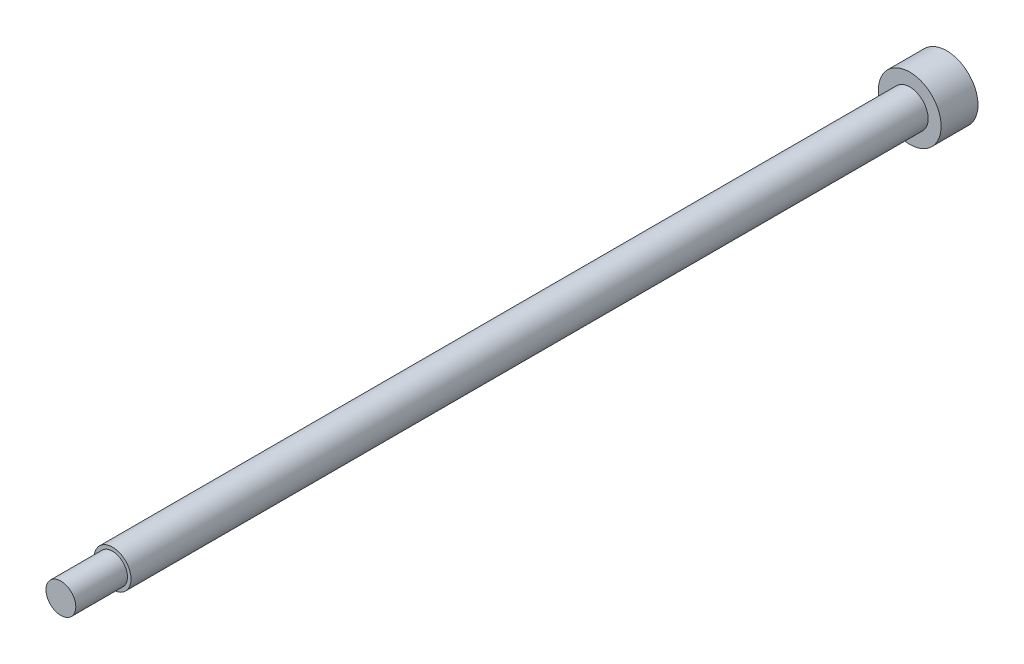
ISO-10303-21;
HEADER;
FILE_DESCRIPTION(('STEP AP214'),'2;1');
FILE_NAME('part.step','',(''),(''),'','','');
FILE_SCHEMA(('AUTOMOTIVE_DESIGN { 1 0 10303 214 1 1 1 1 }'));
ENDSEC;
DATA;
#1=APPLICATION_CONTEXT('core data for automotive mechanical design processes');
#2=APPLICATION_PROTOCOL_DEFINITION('international standard','automotive_design',2000,#1);
#3=PRODUCT_CONTEXT('',#1,'mechanical');
#4=PRODUCT('Part','Part','',(#3));
#5=PRODUCT_RELATED_PRODUCT_CATEGORY('part','',(#4));
#6=PRODUCT_DEFINITION_FORMATION('','',#4);
#7=PRODUCT_DEFINITION_CONTEXT('part definition',#1,'design');
#8=PRODUCT_DEFINITION('design','',#6,#7);
#9=PRODUCT_DEFINITION_SHAPE('','',#8);
#10=(LENGTH_UNIT() NAMED_UNIT(*) SI_UNIT(.MILLI.,.METRE.));
#11=(NAMED_UNIT(*) PLANE_ANGLE_UNIT() SI_UNIT($,.RADIAN.));
#12=(NAMED_UNIT(*) SI_UNIT($,.STERADIAN.) SOLID_ANGLE_UNIT());
#13=UNCERTAINTY_MEASURE_WITH_UNIT(LENGTH_MEASURE(1.E-05),#10,'distance_accuracy_value','');
#14=(GEOMETRIC_REPRESENTATION_CONTEXT(3) GLOBAL_UNCERTAINTY_ASSIGNED_CONTEXT((#13)) GLOBAL_UNIT_ASSIGNED_CONTEXT((#10,
#11,#12)) REPRESENTATION_CONTEXT('',''));
#15=CARTESIAN_POINT('',(0.,0.,0.));
#16=DIRECTION('',(0.,0.,1.));
#17=DIRECTION('',(1.,0.,0.));
#18=AXIS2_PLACEMENT_3D('',#15,#16,#17);
#19=CARTESIAN_POINT('',(0.,0.,115.));
#20=DIRECTION('',(0.,0.,-1.));
#21=DIRECTION('',(-1.,0.,0.));
#22=AXIS2_PLACEMENT_3D('',#19,#20,#21);
#23=CYLINDRICAL_SURFACE('',#22,2.5);
#24=CARTESIAN_POINT('',(0.,0.,115.));
#25=DIRECTION('',(0.,0.,1.));
#26=DIRECTION('',(1.,0.,0.));
#27=AXIS2_PLACEMENT_3D('',#24,#25,#26);
#28=CIRCLE('',#27,2.5);
#29=CARTESIAN_POINT('',(2.5,0.,115.));
#30=VERTEX_POINT('',#29);
#31=EDGE_CURVE('E42',#30,#30,#28,.T.);
#32=ORIENTED_EDGE('',*,*,#31,.F.);
#33=EDGE_LOOP('',(#32));
#34=FACE_BOUND('',#33,.T.);
#35=CARTESIAN_POINT('',(0.,0.,7.));
#36=DIRECTION('',(0.,0.,1.));
#37=DIRECTION('',(1.,0.,0.));
#38=AXIS2_PLACEMENT_3D('',#35,#36,#37);
#39=CIRCLE('',#38,2.5);
#40=CARTESIAN_POINT('',(2.5,0.,7.));
#41=VERTEX_POINT('',#40);
#42=EDGE_CURVE('E37',#41,#41,#39,.T.);
#43=ORIENTED_EDGE('',*,*,#42,.T.);
#44=EDGE_LOOP('',(#43));
#45=FACE_BOUND('',#44,.T.);
#46=ADVANCED_FACE('F40',(#34,#45),#23,.T.);
#47=CARTESIAN_POINT('',(0.,0.,115.));
#48=DIRECTION('',(0.,0.,1.));
#49=DIRECTION('',(1.,0.,0.));
#50=AXIS2_PLACEMENT_3D('',#47,#48,#49);
#51=PLANE('',#50);
#52=CARTESIAN_POINT('',(0.,0.,115.));
#53=DIRECTION('',(0.,0.,1.));
#54=DIRECTION('',(1.,0.,0.));
#55=AXIS2_PLACEMENT_3D('',#52,#53,#54);
#56=CIRCLE('',#55,2.02);
#57=CARTESIAN_POINT('',(2.02,0.,115.));
#58=VERTEX_POINT('',#57);
#59=EDGE_CURVE('E10',#58,#58,#56,.T.);
#60=ORIENTED_EDGE('',*,*,#59,.F.);
#61=EDGE_LOOP('',(#60));
#62=FACE_BOUND('',#61,.T.);
#63=ORIENTED_EDGE('',*,*,#31,.T.);
#64=EDGE_LOOP('',(#63));
#65=FACE_BOUND('',#64,.T.);
#66=ADVANCED_FACE('F79',(#62,#65),#51,.T.);
#67=CARTESIAN_POINT('',(0.,0.,122.));
#68=DIRECTION('',(0.,0.,-1.));
#69=DIRECTION('',(-1.,0.,0.));
#70=AXIS2_PLACEMENT_3D('',#67,#68,#69);
#71=CYLINDRICAL_SURFACE('',#70,2.02);
#72=CARTESIAN_POINT('',(0.,0.,122.));
#73=DIRECTION('',(0.,0.,1.));
#74=DIRECTION('',(1.,0.,0.));
#75=AXIS2_PLACEMENT_3D('',#72,#73,#74);
#76=CIRCLE('',#75,2.02);
#77=CARTESIAN_POINT('',(2.02,0.,122.));
#78=VERTEX_POINT('',#77);
#79=EDGE_CURVE('E47',#78,#78,#76,.T.);
#80=ORIENTED_EDGE('',*,*,#79,.F.);
#81=EDGE_LOOP('',(#80));
#82=FACE_BOUND('',#81,.T.);
#83=ORIENTED_EDGE('',*,*,#59,.T.);
#84=EDGE_LOOP('',(#83));
#85=FACE_BOUND('',#84,.T.);
#86=ADVANCED_FACE('F84',(#82,#85),#71,.T.);
#87=CARTESIAN_POINT('',(0.,0.,122.));
#88=DIRECTION('',(0.,0.,1.));
#89=DIRECTION('',(1.,0.,0.));
#90=AXIS2_PLACEMENT_3D('',#87,#88,#89);
#91=PLANE('',#90);
#92=ORIENTED_EDGE('',*,*,#79,.T.);
#93=EDGE_LOOP('',(#92));
#94=FACE_BOUND('',#93,.T.);
#95=ADVANCED_FACE('F73',(#94),#91,.T.);
#96=CARTESIAN_POINT('',(0.,0.,7.));
#97=DIRECTION('',(0.,0.,-1.));
#98=DIRECTION('',(-1.,0.,0.));
#99=AXIS2_PLACEMENT_3D('',#96,#97,#98);
#100=CYLINDRICAL_SURFACE('',#99,4.25);
#101=CARTESIAN_POINT('',(0.,0.,7.));
#102=DIRECTION('',(0.,0.,1.));
#103=DIRECTION('',(1.,0.,0.));
#104=AXIS2_PLACEMENT_3D('',#101,#102,#103);
#105=CIRCLE('',#104,4.25);
#106=CARTESIAN_POINT('',(4.25,0.,7.));
#107=VERTEX_POINT('',#106);
#108=EDGE_CURVE('E57',#107,#107,#105,.T.);
#109=ORIENTED_EDGE('',*,*,#108,.F.);
#110=EDGE_LOOP('',(#109));
#111=FACE_BOUND('',#110,.T.);
#112=CARTESIAN_POINT('',(0.,0.,2.));
#113=DIRECTION('',(0.,0.,1.));
#114=DIRECTION('',(1.,0.,0.));
#115=AXIS2_PLACEMENT_3D('',#112,#113,#114);
#116=CIRCLE('',#115,4.25);
#117=CARTESIAN_POINT('',(4.25,0.,2.));
#118=VERTEX_POINT('',#117);
#119=EDGE_CURVE('E52',#118,#118,#116,.T.);
#120=ORIENTED_EDGE('',*,*,#119,.T.);
#121=EDGE_LOOP('',(#120));
#122=FACE_BOUND('',#121,.T.);
#123=ADVANCED_FACE('F70',(#111,#122),#100,.T.);
#124=CARTESIAN_POINT('',(0.,0.,7.));
#125=DIRECTION('',(0.,0.,1.));
#126=DIRECTION('',(1.,0.,0.));
#127=AXIS2_PLACEMENT_3D('',#124,#125,#126);
#128=PLANE('',#127);
#129=ORIENTED_EDGE('',*,*,#42,.F.);
#130=EDGE_LOOP('',(#129));
#131=FACE_BOUND('',#130,.T.);
#132=ORIENTED_EDGE('',*,*,#108,.T.);
#133=EDGE_LOOP('',(#132));
#134=FACE_BOUND('',#133,.T.);
#135=ADVANCED_FACE('F64',(#131,#134),#128,.T.);
#136=CARTESIAN_POINT('',(0.,0.,2.));
#137=DIRECTION('',(0.,0.,1.));
#138=DIRECTION('',(1.,0.,0.));
#139=AXIS2_PLACEMENT_3D('',#136,#137,#138);
#140=PLANE('',#139);
#141=ORIENTED_EDGE('',*,*,#119,.F.);
#142=EDGE_LOOP('',(#141));
#143=FACE_BOUND('',#142,.T.);
#144=ADVANCED_FACE('F68',(#143),#140,.F.);
#145=CLOSED_SHELL('',(#46,#66,#86,#95,#123,#135,#144));
#146=MANIFOLD_SOLID_BREP('B2',#145);
#147=ADVANCED_BREP_SHAPE_REPRESENTATION('',(#18,#146),#14);
#148=SHAPE_DEFINITION_REPRESENTATION(#9,#147);
ENDSEC;
END-ISO-10303-21;
